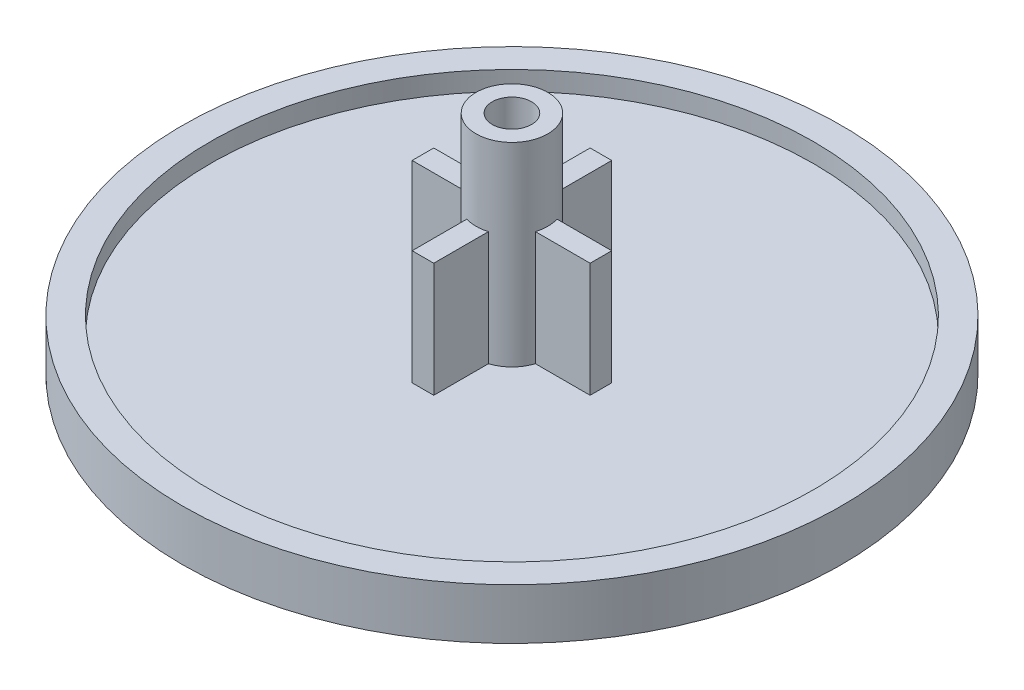
ISO-10303-21;
HEADER;
FILE_DESCRIPTION(('STEP AP214'),'2;1');
FILE_NAME('part.step','',(''),(''),'','','');
FILE_SCHEMA(('AUTOMOTIVE_DESIGN { 1 0 10303 214 1 1 1 1 }'));
ENDSEC;
DATA;
#1=APPLICATION_CONTEXT('core data for automotive mechanical design processes');
#2=APPLICATION_PROTOCOL_DEFINITION('international standard','automotive_design',2000,#1);
#3=PRODUCT_CONTEXT('',#1,'mechanical');
#4=PRODUCT('Part','Part','',(#3));
#5=PRODUCT_RELATED_PRODUCT_CATEGORY('part','',(#4));
#6=PRODUCT_DEFINITION_FORMATION('','',#4);
#7=PRODUCT_DEFINITION_CONTEXT('part definition',#1,'design');
#8=PRODUCT_DEFINITION('design','',#6,#7);
#9=PRODUCT_DEFINITION_SHAPE('','',#8);
#10=(LENGTH_UNIT() NAMED_UNIT(*) SI_UNIT(.MILLI.,.METRE.));
#11=(NAMED_UNIT(*) PLANE_ANGLE_UNIT() SI_UNIT($,.RADIAN.));
#12=(NAMED_UNIT(*) SI_UNIT($,.STERADIAN.) SOLID_ANGLE_UNIT());
#13=UNCERTAINTY_MEASURE_WITH_UNIT(LENGTH_MEASURE(1.E-05),#10,'distance_accuracy_value','');
#14=(GEOMETRIC_REPRESENTATION_CONTEXT(3) GLOBAL_UNCERTAINTY_ASSIGNED_CONTEXT((#13)) GLOBAL_UNIT_ASSIGNED_CONTEXT((#10,
#11,#12)) REPRESENTATION_CONTEXT('',''));
#15=CARTESIAN_POINT('',(0.,0.,0.));
#16=DIRECTION('',(0.,0.,1.));
#17=DIRECTION('',(1.,0.,0.));
#18=AXIS2_PLACEMENT_3D('',#15,#16,#17);
#19=CARTESIAN_POINT('',(0.,1.27,0.));
#20=DIRECTION('',(0.,1.,0.));
#21=DIRECTION('',(0.,0.,1.));
#22=AXIS2_PLACEMENT_3D('',#19,#20,#21);
#23=PLANE('',#22);
#24=CARTESIAN_POINT('',(0.,1.27,0.));
#25=DIRECTION('',(0.,1.,0.));
#26=DIRECTION('',(0.,0.,1.));
#27=AXIS2_PLACEMENT_3D('',#24,#25,#26);
#28=CIRCLE('',#27,12.0523);
#29=CARTESIAN_POINT('',(0.,1.27,-12.0523));
#30=VERTEX_POINT('',#29);
#31=EDGE_CURVE('E265',#30,#30,#28,.F.);
#32=ORIENTED_EDGE('',*,*,#31,.F.);
#33=EDGE_LOOP('',(#32));
#34=FACE_BOUND('',#33,.T.);
#35=DIRECTION('',(1.,0.,0.));
#36=VECTOR('',#35,1.);
#37=CARTESIAN_POINT('',(0.,1.27,-3.556));
#38=LINE('',#37,#36);
#39=CARTESIAN_POINT('',(-0.4318,1.27,-3.556));
#40=VERTEX_POINT('',#39);
#41=CARTESIAN_POINT('',(0.4318,1.27,-3.556));
#42=VERTEX_POINT('',#41);
#43=EDGE_CURVE('E211',#40,#42,#38,.T.);
#44=ORIENTED_EDGE('',*,*,#43,.T.);
#45=DIRECTION('',(0.,0.,1.));
#46=VECTOR('',#45,1.);
#47=CARTESIAN_POINT('',(0.4318,1.27,0.));
#48=LINE('',#47,#46);
#49=CARTESIAN_POINT('',(0.4318,1.27,-1.36859810390048));
#50=VERTEX_POINT('',#49);
#51=EDGE_CURVE('E168',#42,#50,#48,.T.);
#52=ORIENTED_EDGE('',*,*,#51,.T.);
#53=CARTESIAN_POINT('',(0.,1.27,0.));
#54=DIRECTION('',(0.,1.,0.));
#55=DIRECTION('',(0.,0.,1.));
#56=AXIS2_PLACEMENT_3D('',#53,#54,#55);
#57=CIRCLE('',#56,1.4351);
#58=CARTESIAN_POINT('',(1.36859810390048,1.27,-0.4318));
#59=VERTEX_POINT('',#58);
#60=EDGE_CURVE('E251',#59,#50,#57,.T.);
#61=ORIENTED_EDGE('',*,*,#60,.F.);
#62=DIRECTION('',(-1.,0.,0.));
#63=VECTOR('',#62,1.);
#64=CARTESIAN_POINT('',(0.,1.27,-0.4318));
#65=LINE('',#64,#63);
#66=CARTESIAN_POINT('',(3.556,1.27,-0.4318));
#67=VERTEX_POINT('',#66);
#68=EDGE_CURVE('E242',#67,#59,#65,.T.);
#69=ORIENTED_EDGE('',*,*,#68,.F.);
#70=DIRECTION('',(0.,0.,1.));
#71=VECTOR('',#70,1.);
#72=CARTESIAN_POINT('',(3.556,1.27,0.));
#73=LINE('',#72,#71);
#74=CARTESIAN_POINT('',(3.556,1.27,0.4318));
#75=VERTEX_POINT('',#74);
#76=EDGE_CURVE('E285',#67,#75,#73,.T.);
#77=ORIENTED_EDGE('',*,*,#76,.T.);
#78=DIRECTION('',(-1.,0.,0.));
#79=VECTOR('',#78,1.);
#80=CARTESIAN_POINT('',(0.,1.27,0.4318));
#81=LINE('',#80,#79);
#82=CARTESIAN_POINT('',(1.36859810390048,1.27,0.4318));
#83=VERTEX_POINT('',#82);
#84=EDGE_CURVE('E246',#75,#83,#81,.T.);
#85=ORIENTED_EDGE('',*,*,#84,.T.);
#86=CARTESIAN_POINT('',(0.4318,1.27,1.36859810390048));
#87=VERTEX_POINT('',#86);
#88=EDGE_CURVE('E256',#87,#83,#57,.T.);
#89=ORIENTED_EDGE('',*,*,#88,.F.);
#90=CARTESIAN_POINT('',(0.4318,1.27,3.556));
#91=VERTEX_POINT('',#90);
#92=EDGE_CURVE('E206',#87,#91,#48,.T.);
#93=ORIENTED_EDGE('',*,*,#92,.T.);
#94=DIRECTION('',(-1.,0.,0.));
#95=VECTOR('',#94,1.);
#96=CARTESIAN_POINT('',(0.,1.27,3.556));
#97=LINE('',#96,#95);
#98=CARTESIAN_POINT('',(-0.4318,1.27,3.556));
#99=VERTEX_POINT('',#98);
#100=EDGE_CURVE('E213',#91,#99,#97,.T.);
#101=ORIENTED_EDGE('',*,*,#100,.T.);
#102=DIRECTION('',(0.,0.,1.));
#103=VECTOR('',#102,1.);
#104=CARTESIAN_POINT('',(-0.4318,1.27,0.));
#105=LINE('',#104,#103);
#106=CARTESIAN_POINT('',(-0.4318,1.27,1.36859810390048));
#107=VERTEX_POINT('',#106);
#108=EDGE_CURVE('E200',#107,#99,#105,.T.);
#109=ORIENTED_EDGE('',*,*,#108,.F.);
#110=CARTESIAN_POINT('',(-1.36859810390048,1.27,0.4318));
#111=VERTEX_POINT('',#110);
#112=EDGE_CURVE('E252',#111,#107,#57,.T.);
#113=ORIENTED_EDGE('',*,*,#112,.F.);
#114=CARTESIAN_POINT('',(-3.556,1.27,0.4318));
#115=VERTEX_POINT('',#114);
#116=EDGE_CURVE('E243',#111,#115,#81,.T.);
#117=ORIENTED_EDGE('',*,*,#116,.T.);
#118=DIRECTION('',(0.,0.,-1.));
#119=VECTOR('',#118,1.);
#120=CARTESIAN_POINT('',(-3.556,1.27,0.));
#121=LINE('',#120,#119);
#122=CARTESIAN_POINT('',(-3.556,1.27,-0.4318));
#123=VERTEX_POINT('',#122);
#124=EDGE_CURVE('E283',#115,#123,#121,.T.);
#125=ORIENTED_EDGE('',*,*,#124,.T.);
#126=CARTESIAN_POINT('',(-1.36859810390048,1.27,-0.4318));
#127=VERTEX_POINT('',#126);
#128=EDGE_CURVE('E240',#127,#123,#65,.T.);
#129=ORIENTED_EDGE('',*,*,#128,.F.);
#130=CARTESIAN_POINT('',(-0.4318,1.27,-1.36859810390048));
#131=VERTEX_POINT('',#130);
#132=EDGE_CURVE('E255',#131,#127,#57,.T.);
#133=ORIENTED_EDGE('',*,*,#132,.F.);
#134=EDGE_CURVE('E71',#40,#131,#105,.T.);
#135=ORIENTED_EDGE('',*,*,#134,.F.);
#136=EDGE_LOOP('',(#44,#52,#61,#69,#77,#85,#89,#93,#101,#109,#113,#117,#125,#129,#133,#135));
#137=FACE_BOUND('',#136,.T.);
#138=ADVANCED_FACE('F48',(#34,#137),#23,.T.);
#139=CARTESIAN_POINT('',(0.,9.0424,0.));
#140=DIRECTION('',(0.,-1.,0.));
#141=DIRECTION('',(0.,0.,-1.));
#142=AXIS2_PLACEMENT_3D('',#139,#140,#141);
#143=CYLINDRICAL_SURFACE('',#142,1.4351);
#144=CARTESIAN_POINT('',(0.,9.0424,0.));
#145=DIRECTION('',(0.,1.,0.));
#146=DIRECTION('',(0.,0.,1.));
#147=AXIS2_PLACEMENT_3D('',#144,#145,#146);
#148=CIRCLE('',#147,1.4351);
#149=CARTESIAN_POINT('',(0.,9.0424,1.4351));
#150=VERTEX_POINT('',#149);
#151=EDGE_CURVE('E247',#150,#150,#148,.T.);
#152=ORIENTED_EDGE('',*,*,#151,.F.);
#153=EDGE_LOOP('',(#152));
#154=FACE_BOUND('',#153,.T.);
#155=DIRECTION('',(0.,-1.,0.));
#156=VECTOR('',#155,1.);
#157=CARTESIAN_POINT('',(0.4318,9.0424,-1.36859810390048));
#158=LINE('',#157,#156);
#159=CARTESIAN_POINT('',(0.4318,5.842,-1.36859810390048));
#160=VERTEX_POINT('',#159);
#161=EDGE_CURVE('E209',#160,#50,#158,.T.);
#162=ORIENTED_EDGE('',*,*,#161,.F.);
#163=CARTESIAN_POINT('',(0.,5.842,0.));
#164=DIRECTION('',(0.,-1.,0.));
#165=DIRECTION('',(0.,0.,-1.));
#166=AXIS2_PLACEMENT_3D('',#163,#164,#165);
#167=CIRCLE('',#166,1.4351);
#168=CARTESIAN_POINT('',(-0.4318,5.842,-1.36859810390048));
#169=VERTEX_POINT('',#168);
#170=EDGE_CURVE('E13',#169,#160,#167,.T.);
#171=ORIENTED_EDGE('',*,*,#170,.F.);
#172=DIRECTION('',(0.,-1.,0.));
#173=VECTOR('',#172,1.);
#174=CARTESIAN_POINT('',(-0.4318,9.0424,-1.36859810390048));
#175=LINE('',#174,#173);
#176=EDGE_CURVE('E202',#169,#131,#175,.T.);
#177=ORIENTED_EDGE('',*,*,#176,.T.);
#178=ORIENTED_EDGE('',*,*,#132,.T.);
#179=DIRECTION('',(0.,-1.,0.));
#180=VECTOR('',#179,1.);
#181=CARTESIAN_POINT('',(-1.36859810390048,9.0424,-0.4318));
#182=LINE('',#181,#180);
#183=CARTESIAN_POINT('',(-1.36859810390048,5.842,-0.4318));
#184=VERTEX_POINT('',#183);
#185=EDGE_CURVE('E268',#127,#184,#182,.F.);
#186=ORIENTED_EDGE('',*,*,#185,.T.);
#187=CARTESIAN_POINT('',(0.,5.842,0.));
#188=DIRECTION('',(0.,-1.,0.));
#189=DIRECTION('',(0.,0.,-1.));
#190=AXIS2_PLACEMENT_3D('',#187,#188,#189);
#191=CIRCLE('',#190,1.4351);
#192=CARTESIAN_POINT('',(-1.36859810390048,5.842,0.4318));
#193=VERTEX_POINT('',#192);
#194=EDGE_CURVE('E271',#193,#184,#191,.T.);
#195=ORIENTED_EDGE('',*,*,#194,.F.);
#196=DIRECTION('',(0.,-1.,0.));
#197=VECTOR('',#196,1.);
#198=CARTESIAN_POINT('',(-1.36859810390048,9.0424,0.4318));
#199=LINE('',#198,#197);
#200=EDGE_CURVE('E274',#111,#193,#199,.F.);
#201=ORIENTED_EDGE('',*,*,#200,.F.);
#202=ORIENTED_EDGE('',*,*,#112,.T.);
#203=DIRECTION('',(0.,-1.,0.));
#204=VECTOR('',#203,1.);
#205=CARTESIAN_POINT('',(-0.4318,9.0424,1.36859810390048));
#206=LINE('',#205,#204);
#207=CARTESIAN_POINT('',(-0.4318,5.842,1.36859810390048));
#208=VERTEX_POINT('',#207);
#209=EDGE_CURVE('E181',#107,#208,#206,.F.);
#210=ORIENTED_EDGE('',*,*,#209,.T.);
#211=CARTESIAN_POINT('',(0.4318,5.842,1.36859810390048));
#212=VERTEX_POINT('',#211);
#213=EDGE_CURVE('E52',#212,#208,#167,.T.);
#214=ORIENTED_EDGE('',*,*,#213,.F.);
#215=DIRECTION('',(0.,-1.,0.));
#216=VECTOR('',#215,1.);
#217=CARTESIAN_POINT('',(0.4318,9.0424,1.36859810390048));
#218=LINE('',#217,#216);
#219=EDGE_CURVE('E204',#87,#212,#218,.F.);
#220=ORIENTED_EDGE('',*,*,#219,.F.);
#221=ORIENTED_EDGE('',*,*,#88,.T.);
#222=DIRECTION('',(0.,-1.,0.));
#223=VECTOR('',#222,1.);
#224=CARTESIAN_POINT('',(1.36859810390048,9.0424,0.4318));
#225=LINE('',#224,#223);
#226=CARTESIAN_POINT('',(1.36859810390048,5.842,0.4318));
#227=VERTEX_POINT('',#226);
#228=EDGE_CURVE('E280',#227,#83,#225,.T.);
#229=ORIENTED_EDGE('',*,*,#228,.F.);
#230=CARTESIAN_POINT('',(1.36859810390048,5.842,-0.4318));
#231=VERTEX_POINT('',#230);
#232=EDGE_CURVE('E275',#231,#227,#191,.T.);
#233=ORIENTED_EDGE('',*,*,#232,.F.);
#234=DIRECTION('',(0.,-1.,0.));
#235=VECTOR('',#234,1.);
#236=CARTESIAN_POINT('',(1.36859810390048,9.0424,-0.4318));
#237=LINE('',#236,#235);
#238=EDGE_CURVE('E277',#231,#59,#237,.T.);
#239=ORIENTED_EDGE('',*,*,#238,.T.);
#240=ORIENTED_EDGE('',*,*,#60,.T.);
#241=EDGE_LOOP('',(#162,#171,#177,#178,#186,#195,#201,#202,#210,#214,#220,#221,#229,#233,#239,#240));
#242=FACE_BOUND('',#241,.T.);
#243=ADVANCED_FACE('F297',(#154,#242),#143,.T.);
#244=CARTESIAN_POINT('',(0.,1.27,0.));
#245=DIRECTION('',(0.,-1.,0.));
#246=DIRECTION('',(0.,0.,-1.));
#247=AXIS2_PLACEMENT_3D('',#244,#245,#246);
#248=CYLINDRICAL_SURFACE('',#247,13.1699);
#249=CARTESIAN_POINT('',(0.,0.,0.));
#250=DIRECTION('',(0.,1.,0.));
#251=DIRECTION('',(0.,0.,1.));
#252=AXIS2_PLACEMENT_3D('',#249,#250,#251);
#253=CIRCLE('',#252,13.1699);
#254=CARTESIAN_POINT('',(0.,0.,13.1699));
#255=VERTEX_POINT('',#254);
#256=EDGE_CURVE('E262',#255,#255,#253,.T.);
#257=ORIENTED_EDGE('',*,*,#256,.T.);
#258=EDGE_LOOP('',(#257));
#259=FACE_BOUND('',#258,.T.);
#260=CARTESIAN_POINT('',(0.,2.032,0.));
#261=DIRECTION('',(0.,1.,0.));
#262=DIRECTION('',(0.,0.,1.));
#263=AXIS2_PLACEMENT_3D('',#260,#261,#262);
#264=CIRCLE('',#263,13.1699);
#265=CARTESIAN_POINT('',(0.,2.032,13.1699));
#266=VERTEX_POINT('',#265);
#267=EDGE_CURVE('E259',#266,#266,#264,.T.);
#268=ORIENTED_EDGE('',*,*,#267,.F.);
#269=EDGE_LOOP('',(#268));
#270=FACE_BOUND('',#269,.T.);
#271=ADVANCED_FACE('F50',(#259,#270),#248,.T.);
#272=CARTESIAN_POINT('',(0.,0.,0.));
#273=DIRECTION('',(0.,1.,0.));
#274=DIRECTION('',(0.,0.,1.));
#275=AXIS2_PLACEMENT_3D('',#272,#273,#274);
#276=PLANE('',#275);
#277=ORIENTED_EDGE('',*,*,#256,.F.);
#278=EDGE_LOOP('',(#277));
#279=FACE_BOUND('',#278,.T.);
#280=ADVANCED_FACE('F332',(#279),#276,.F.);
#281=CARTESIAN_POINT('',(0.,2.032,0.));
#282=DIRECTION('',(0.,1.,0.));
#283=DIRECTION('',(0.,0.,1.));
#284=AXIS2_PLACEMENT_3D('',#281,#282,#283);
#285=PLANE('',#284);
#286=ORIENTED_EDGE('',*,*,#267,.T.);
#287=EDGE_LOOP('',(#286));
#288=FACE_BOUND('',#287,.T.);
#289=CARTESIAN_POINT('',(0.,2.032,0.));
#290=DIRECTION('',(0.,1.,0.));
#291=DIRECTION('',(0.,0.,1.));
#292=AXIS2_PLACEMENT_3D('',#289,#290,#291);
#293=CIRCLE('',#292,12.0523);
#294=CARTESIAN_POINT('',(0.,2.032,-12.0523));
#295=VERTEX_POINT('',#294);
#296=EDGE_CURVE('E250',#295,#295,#293,.T.);
#297=ORIENTED_EDGE('',*,*,#296,.F.);
#298=EDGE_LOOP('',(#297));
#299=FACE_BOUND('',#298,.T.);
#300=ADVANCED_FACE('F340',(#288,#299),#285,.T.);
#301=CARTESIAN_POINT('',(0.,2.032,0.));
#302=DIRECTION('',(0.,-1.,0.));
#303=DIRECTION('',(0.,0.,-1.));
#304=AXIS2_PLACEMENT_3D('',#301,#302,#303);
#305=CYLINDRICAL_SURFACE('',#304,12.0523);
#306=CARTESIAN_POINT('',(0.,2.032,-12.0523));
#307=CARTESIAN_POINT('',(0.,2.0240625,-12.0523));
#308=CARTESIAN_POINT('',(0.,2.016125,-12.0523));
#309=CARTESIAN_POINT('',(0.,2.00025,-12.0523));
#310=CARTESIAN_POINT('',(0.,1.9923125,-12.0523));
#311=CARTESIAN_POINT('',(0.,1.9764375,-12.0523));
#312=CARTESIAN_POINT('',(0.,1.9685,-12.0523));
#313=CARTESIAN_POINT('',(0.,1.952625,-12.0523));
#314=CARTESIAN_POINT('',(0.,1.9446875,-12.0523));
#315=CARTESIAN_POINT('',(0.,1.9288125,-12.0523));
#316=CARTESIAN_POINT('',(0.,1.920875,-12.0523));
#317=CARTESIAN_POINT('',(0.,1.905,-12.0523));
#318=CARTESIAN_POINT('',(0.,1.8970625,-12.0523));
#319=CARTESIAN_POINT('',(0.,1.8811875,-12.0523));
#320=CARTESIAN_POINT('',(0.,1.87325,-12.0523));
#321=CARTESIAN_POINT('',(0.,1.857375,-12.0523));
#322=CARTESIAN_POINT('',(0.,1.8494375,-12.0523));
#323=CARTESIAN_POINT('',(0.,1.8335625,-12.0523));
#324=CARTESIAN_POINT('',(0.,1.825625,-12.0523));
#325=CARTESIAN_POINT('',(0.,1.80975,-12.0523));
#326=CARTESIAN_POINT('',(0.,1.8018125,-12.0523));
#327=CARTESIAN_POINT('',(0.,1.7859375,-12.0523));
#328=CARTESIAN_POINT('',(0.,1.778,-12.0523));
#329=CARTESIAN_POINT('',(0.,1.762125,-12.0523));
#330=CARTESIAN_POINT('',(0.,1.7541875,-12.0523));
#331=CARTESIAN_POINT('',(0.,1.7383125,-12.0523));
#332=CARTESIAN_POINT('',(0.,1.730375,-12.0523));
#333=CARTESIAN_POINT('',(0.,1.7145,-12.0523));
#334=CARTESIAN_POINT('',(0.,1.7065625,-12.0523));
#335=CARTESIAN_POINT('',(0.,1.6906875,-12.0523));
#336=CARTESIAN_POINT('',(0.,1.68275,-12.0523));
#337=CARTESIAN_POINT('',(0.,1.666875,-12.0523));
#338=CARTESIAN_POINT('',(0.,1.6589375,-12.0523));
#339=CARTESIAN_POINT('',(0.,1.6430625,-12.0523));
#340=CARTESIAN_POINT('',(0.,1.635125,-12.0523));
#341=CARTESIAN_POINT('',(0.,1.61925,-12.0523));
#342=CARTESIAN_POINT('',(0.,1.6113125,-12.0523));
#343=CARTESIAN_POINT('',(0.,1.5954375,-12.0523));
#344=CARTESIAN_POINT('',(0.,1.5875,-12.0523));
#345=CARTESIAN_POINT('',(0.,1.571625,-12.0523));
#346=CARTESIAN_POINT('',(0.,1.5636875,-12.0523));
#347=CARTESIAN_POINT('',(0.,1.5478125,-12.0523));
#348=CARTESIAN_POINT('',(0.,1.539875,-12.0523));
#349=CARTESIAN_POINT('',(0.,1.524,-12.0523));
#350=CARTESIAN_POINT('',(0.,1.5160625,-12.0523));
#351=CARTESIAN_POINT('',(0.,1.5001875,-12.0523));
#352=CARTESIAN_POINT('',(0.,1.49225,-12.0523));
#353=CARTESIAN_POINT('',(0.,1.476375,-12.0523));
#354=CARTESIAN_POINT('',(0.,1.4684375,-12.0523));
#355=CARTESIAN_POINT('',(0.,1.4525625,-12.0523));
#356=CARTESIAN_POINT('',(0.,1.444625,-12.0523));
#357=CARTESIAN_POINT('',(0.,1.42875,-12.0523));
#358=CARTESIAN_POINT('',(0.,1.4208125,-12.0523));
#359=CARTESIAN_POINT('',(0.,1.4049375,-12.0523));
#360=CARTESIAN_POINT('',(0.,1.397,-12.0523));
#361=CARTESIAN_POINT('',(0.,1.381125,-12.0523));
#362=CARTESIAN_POINT('',(0.,1.3731875,-12.0523));
#363=CARTESIAN_POINT('',(0.,1.3573125,-12.0523));
#364=CARTESIAN_POINT('',(0.,1.349375,-12.0523));
#365=CARTESIAN_POINT('',(0.,1.3335,-12.0523));
#366=CARTESIAN_POINT('',(0.,1.3255625,-12.0523));
#367=CARTESIAN_POINT('',(0.,1.3096875,-12.0523));
#368=CARTESIAN_POINT('',(0.,1.30175,-12.0523));
#369=CARTESIAN_POINT('',(0.,1.285875,-12.0523));
#370=CARTESIAN_POINT('',(0.,1.2779375,-12.0523));
#371=CARTESIAN_POINT('',(0.,1.27,-12.0523));
#372=B_SPLINE_CURVE_WITH_KNOTS('',3,(#306,#307,#308,#309,#310,#311,#312,#313,#314,#315,#316,
#317,#318,#319,#320,#321,#322,#323,#324,#325,#326,#327,#328,#329,#330,#331,#332,#333,#334,#335,
#336,#337,#338,#339,#340,#341,#342,#343,#344,#345,#346,#347,#348,#349,#350,#351,#352,#353,#354,
#355,#356,#357,#358,#359,#360,#361,#362,#363,#364,#365,#366,#367,#368,#369,#370,#371),
.UNSPECIFIED.,.F.,.F.,(4,2,2,2,2,2,2,2,2,2,2,2,2,2,2,2,2,2,2,2,2,2,2,2,2,2,2,2,2,2,2,2,4),(0.,
0.0238125000000004,0.0476250000000004,0.0714375000000003,0.0952500000000003,0.1190625,0.142875,
0.1666875,0.1905,0.2143125,0.238125,0.2619375,0.28575,0.3095625,0.333375,0.3571875,0.381,
0.4048125,0.428625,0.4524375,0.47625,0.5000625,0.523875,0.5476875,0.5715,0.5953125,0.619125,
0.6429375,0.66675,0.6905625,0.714375,0.7381875,0.762),.UNSPECIFIED.);
#373=EDGE_CURVE('BSEAM322',#295,#30,#372,.T.);
#374=ORIENTED_EDGE('',*,*,#296,.T.);
#375=ORIENTED_EDGE('',*,*,#31,.T.);
#376=ORIENTED_EDGE('',*,*,#373,.T.);
#377=ORIENTED_EDGE('',*,*,#373,.F.);
#378=EDGE_LOOP('',(#374,#376,#375,#377));
#379=FACE_BOUND('',#378,.T.);
#380=ADVANCED_FACE('F322',(#379),#305,.F.);
#381=CARTESIAN_POINT('',(0.,9.0424,0.));
#382=DIRECTION('',(0.,1.,0.));
#383=DIRECTION('',(0.,0.,1.));
#384=AXIS2_PLACEMENT_3D('',#381,#382,#383);
#385=PLANE('',#384);
#386=CARTESIAN_POINT('',(0.,9.0424,0.));
#387=DIRECTION('',(0.,1.,0.));
#388=DIRECTION('',(0.,0.,1.));
#389=AXIS2_PLACEMENT_3D('',#386,#387,#388);
#390=CIRCLE('',#389,0.7874);
#391=CARTESIAN_POINT('',(0.,9.0424,0.7874));
#392=VERTEX_POINT('',#391);
#393=EDGE_CURVE('E312',#392,#392,#390,.T.);
#394=ORIENTED_EDGE('',*,*,#393,.F.);
#395=EDGE_LOOP('',(#394));
#396=FACE_BOUND('',#395,.T.);
#397=ORIENTED_EDGE('',*,*,#151,.T.);
#398=EDGE_LOOP('',(#397));
#399=FACE_BOUND('',#398,.T.);
#400=ADVANCED_FACE('F318',(#396,#399),#385,.T.);
#401=CARTESIAN_POINT('',(0.,0.,-0.4318));
#402=DIRECTION('',(0.,0.,-1.));
#403=DIRECTION('',(-1.,0.,0.));
#404=AXIS2_PLACEMENT_3D('',#401,#402,#403);
#405=PLANE('',#404);
#406=ORIENTED_EDGE('',*,*,#185,.F.);
#407=ORIENTED_EDGE('',*,*,#128,.T.);
#408=DIRECTION('',(0.,-1.,0.));
#409=VECTOR('',#408,1.);
#410=CARTESIAN_POINT('',(-3.556,0.,-0.4318));
#411=LINE('',#410,#409);
#412=CARTESIAN_POINT('',(-3.556,5.842,-0.4318));
#413=VERTEX_POINT('',#412);
#414=EDGE_CURVE('E216',#413,#123,#411,.T.);
#415=ORIENTED_EDGE('',*,*,#414,.F.);
#416=DIRECTION('',(-1.,0.,0.));
#417=VECTOR('',#416,1.);
#418=CARTESIAN_POINT('',(-3.556,5.842,-0.4318));
#419=LINE('',#418,#417);
#420=EDGE_CURVE('E232',#184,#413,#419,.T.);
#421=ORIENTED_EDGE('',*,*,#420,.F.);
#422=EDGE_LOOP('',(#406,#407,#415,#421));
#423=FACE_BOUND('',#422,.T.);
#424=ADVANCED_FACE('F321',(#423),#405,.T.);
#425=CARTESIAN_POINT('',(0.,0.,0.4318));
#426=DIRECTION('',(0.,0.,-1.));
#427=DIRECTION('',(-1.,0.,0.));
#428=AXIS2_PLACEMENT_3D('',#425,#426,#427);
#429=PLANE('',#428);
#430=ORIENTED_EDGE('',*,*,#116,.F.);
#431=ORIENTED_EDGE('',*,*,#200,.T.);
#432=DIRECTION('',(-1.,0.,0.));
#433=VECTOR('',#432,1.);
#434=CARTESIAN_POINT('',(-3.556,5.842,0.4318));
#435=LINE('',#434,#433);
#436=CARTESIAN_POINT('',(-3.556,5.842,0.4318));
#437=VERTEX_POINT('',#436);
#438=EDGE_CURVE('E223',#193,#437,#435,.T.);
#439=ORIENTED_EDGE('',*,*,#438,.T.);
#440=DIRECTION('',(0.,-1.,0.));
#441=VECTOR('',#440,1.);
#442=CARTESIAN_POINT('',(-3.556,0.,0.4318));
#443=LINE('',#442,#441);
#444=EDGE_CURVE('E217',#437,#115,#443,.T.);
#445=ORIENTED_EDGE('',*,*,#444,.T.);
#446=EDGE_LOOP('',(#430,#431,#439,#445));
#447=FACE_BOUND('',#446,.T.);
#448=ADVANCED_FACE('F378',(#447),#429,.F.);
#449=CARTESIAN_POINT('',(-3.556,5.842,0.4318));
#450=DIRECTION('',(0.,-1.,0.));
#451=DIRECTION('',(0.,0.,-1.));
#452=AXIS2_PLACEMENT_3D('',#449,#450,#451);
#453=PLANE('',#452);
#454=ORIENTED_EDGE('',*,*,#438,.F.);
#455=ORIENTED_EDGE('',*,*,#194,.T.);
#456=ORIENTED_EDGE('',*,*,#420,.T.);
#457=DIRECTION('',(0.,0.,-1.));
#458=VECTOR('',#457,1.);
#459=CARTESIAN_POINT('',(-3.556,5.842,0.4318));
#460=LINE('',#459,#458);
#461=EDGE_CURVE('E227',#437,#413,#460,.T.);
#462=ORIENTED_EDGE('',*,*,#461,.F.);
#463=EDGE_LOOP('',(#454,#455,#456,#462));
#464=FACE_BOUND('',#463,.T.);
#465=ADVANCED_FACE('F387',(#464),#453,.F.);
#466=CARTESIAN_POINT('',(-3.556,0.,0.4318));
#467=DIRECTION('',(1.,0.,0.));
#468=DIRECTION('',(0.,0.,-1.));
#469=AXIS2_PLACEMENT_3D('',#466,#467,#468);
#470=PLANE('',#469);
#471=ORIENTED_EDGE('',*,*,#124,.F.);
#472=ORIENTED_EDGE('',*,*,#444,.F.);
#473=ORIENTED_EDGE('',*,*,#461,.T.);
#474=ORIENTED_EDGE('',*,*,#414,.T.);
#475=EDGE_LOOP('',(#471,#472,#473,#474));
#476=FACE_BOUND('',#475,.T.);
#477=ADVANCED_FACE('F396',(#476),#470,.F.);
#478=CARTESIAN_POINT('',(3.556,5.842,-0.4318));
#479=VERTEX_POINT('',#478);
#480=EDGE_CURVE('E221',#479,#231,#419,.T.);
#481=ORIENTED_EDGE('',*,*,#480,.T.);
#482=ORIENTED_EDGE('',*,*,#232,.T.);
#483=CARTESIAN_POINT('',(3.556,5.842,0.4318));
#484=VERTEX_POINT('',#483);
#485=EDGE_CURVE('E224',#484,#227,#435,.T.);
#486=ORIENTED_EDGE('',*,*,#485,.F.);
#487=DIRECTION('',(0.,0.,-1.));
#488=VECTOR('',#487,1.);
#489=CARTESIAN_POINT('',(3.556,5.842,0.4318));
#490=LINE('',#489,#488);
#491=EDGE_CURVE('E237',#484,#479,#490,.T.);
#492=ORIENTED_EDGE('',*,*,#491,.T.);
#493=EDGE_LOOP('',(#481,#482,#486,#492));
#494=FACE_BOUND('',#493,.T.);
#495=ADVANCED_FACE('F399',(#494),#453,.F.);
#496=ORIENTED_EDGE('',*,*,#84,.F.);
#497=DIRECTION('',(0.,1.,0.));
#498=VECTOR('',#497,1.);
#499=CARTESIAN_POINT('',(3.556,0.,0.4318));
#500=LINE('',#499,#498);
#501=EDGE_CURVE('E220',#75,#484,#500,.T.);
#502=ORIENTED_EDGE('',*,*,#501,.T.);
#503=ORIENTED_EDGE('',*,*,#485,.T.);
#504=ORIENTED_EDGE('',*,*,#228,.T.);
#505=EDGE_LOOP('',(#496,#502,#503,#504));
#506=FACE_BOUND('',#505,.T.);
#507=ADVANCED_FACE('F390',(#506),#429,.F.);
#508=DIRECTION('',(0.,1.,0.));
#509=VECTOR('',#508,1.);
#510=CARTESIAN_POINT('',(3.556,0.,-0.4318));
#511=LINE('',#510,#509);
#512=EDGE_CURVE('E230',#67,#479,#511,.T.);
#513=ORIENTED_EDGE('',*,*,#512,.F.);
#514=ORIENTED_EDGE('',*,*,#68,.T.);
#515=ORIENTED_EDGE('',*,*,#238,.F.);
#516=ORIENTED_EDGE('',*,*,#480,.F.);
#517=EDGE_LOOP('',(#513,#514,#515,#516));
#518=FACE_BOUND('',#517,.T.);
#519=ADVANCED_FACE('F381',(#518),#405,.T.);
#520=CARTESIAN_POINT('',(3.556,0.,0.4318));
#521=DIRECTION('',(-1.,0.,0.));
#522=DIRECTION('',(0.,0.,1.));
#523=AXIS2_PLACEMENT_3D('',#520,#521,#522);
#524=PLANE('',#523);
#525=ORIENTED_EDGE('',*,*,#76,.F.);
#526=ORIENTED_EDGE('',*,*,#512,.T.);
#527=ORIENTED_EDGE('',*,*,#491,.F.);
#528=ORIENTED_EDGE('',*,*,#501,.F.);
#529=EDGE_LOOP('',(#525,#526,#527,#528));
#530=FACE_BOUND('',#529,.T.);
#531=ADVANCED_FACE('F423',(#530),#524,.F.);
#532=CARTESIAN_POINT('',(-0.4318,0.,0.));
#533=DIRECTION('',(-1.,0.,0.));
#534=DIRECTION('',(0.,0.,1.));
#535=AXIS2_PLACEMENT_3D('',#532,#533,#534);
#536=PLANE('',#535);
#537=ORIENTED_EDGE('',*,*,#209,.F.);
#538=ORIENTED_EDGE('',*,*,#108,.T.);
#539=DIRECTION('',(0.,-1.,0.));
#540=VECTOR('',#539,1.);
#541=CARTESIAN_POINT('',(-0.4318,0.,3.556));
#542=LINE('',#541,#540);
#543=CARTESIAN_POINT('',(-0.4318,5.842,3.556));
#544=VERTEX_POINT('',#543);
#545=EDGE_CURVE('E191',#544,#99,#542,.T.);
#546=ORIENTED_EDGE('',*,*,#545,.F.);
#547=DIRECTION('',(0.,0.,1.));
#548=VECTOR('',#547,1.);
#549=CARTESIAN_POINT('',(-0.4318,5.842,3.556));
#550=LINE('',#549,#548);
#551=EDGE_CURVE('E63',#208,#544,#550,.T.);
#552=ORIENTED_EDGE('',*,*,#551,.F.);
#553=EDGE_LOOP('',(#537,#538,#546,#552));
#554=FACE_BOUND('',#553,.T.);
#555=ADVANCED_FACE('F301',(#554),#536,.T.);
#556=CARTESIAN_POINT('',(0.4318,0.,0.));
#557=DIRECTION('',(-1.,0.,0.));
#558=DIRECTION('',(0.,0.,1.));
#559=AXIS2_PLACEMENT_3D('',#556,#557,#558);
#560=PLANE('',#559);
#561=ORIENTED_EDGE('',*,*,#92,.F.);
#562=ORIENTED_EDGE('',*,*,#219,.T.);
#563=DIRECTION('',(0.,0.,1.));
#564=VECTOR('',#563,1.);
#565=CARTESIAN_POINT('',(0.4318,5.842,3.556));
#566=LINE('',#565,#564);
#567=CARTESIAN_POINT('',(0.4318,5.842,3.556));
#568=VERTEX_POINT('',#567);
#569=EDGE_CURVE('E171',#212,#568,#566,.T.);
#570=ORIENTED_EDGE('',*,*,#569,.T.);
#571=DIRECTION('',(0.,-1.,0.));
#572=VECTOR('',#571,1.);
#573=CARTESIAN_POINT('',(0.4318,0.,3.556));
#574=LINE('',#573,#572);
#575=EDGE_CURVE('E172',#568,#91,#574,.T.);
#576=ORIENTED_EDGE('',*,*,#575,.T.);
#577=EDGE_LOOP('',(#561,#562,#570,#576));
#578=FACE_BOUND('',#577,.T.);
#579=ADVANCED_FACE('F308',(#578),#560,.F.);
#580=CARTESIAN_POINT('',(0.4318,5.842,3.556));
#581=DIRECTION('',(0.,-1.,0.));
#582=DIRECTION('',(0.,0.,-1.));
#583=AXIS2_PLACEMENT_3D('',#580,#581,#582);
#584=PLANE('',#583);
#585=ORIENTED_EDGE('',*,*,#569,.F.);
#586=ORIENTED_EDGE('',*,*,#213,.T.);
#587=ORIENTED_EDGE('',*,*,#551,.T.);
#588=DIRECTION('',(-1.,0.,0.));
#589=VECTOR('',#588,1.);
#590=CARTESIAN_POINT('',(0.4318,5.842,3.556));
#591=LINE('',#590,#589);
#592=EDGE_CURVE('E182',#568,#544,#591,.T.);
#593=ORIENTED_EDGE('',*,*,#592,.F.);
#594=EDGE_LOOP('',(#585,#586,#587,#593));
#595=FACE_BOUND('',#594,.T.);
#596=ADVANCED_FACE('F293',(#595),#584,.F.);
#597=CARTESIAN_POINT('',(0.4318,0.,3.556));
#598=DIRECTION('',(0.,0.,-1.));
#599=DIRECTION('',(-1.,0.,0.));
#600=AXIS2_PLACEMENT_3D('',#597,#598,#599);
#601=PLANE('',#600);
#602=ORIENTED_EDGE('',*,*,#100,.F.);
#603=ORIENTED_EDGE('',*,*,#575,.F.);
#604=ORIENTED_EDGE('',*,*,#592,.T.);
#605=ORIENTED_EDGE('',*,*,#545,.T.);
#606=EDGE_LOOP('',(#602,#603,#604,#605));
#607=FACE_BOUND('',#606,.T.);
#608=ADVANCED_FACE('F306',(#607),#601,.F.);
#609=ORIENTED_EDGE('',*,*,#51,.F.);
#610=DIRECTION('',(0.,1.,0.));
#611=VECTOR('',#610,1.);
#612=CARTESIAN_POINT('',(0.4318,0.,-3.556));
#613=LINE('',#612,#611);
#614=CARTESIAN_POINT('',(0.4318,5.842,-3.556));
#615=VERTEX_POINT('',#614);
#616=EDGE_CURVE('E161',#42,#615,#613,.T.);
#617=ORIENTED_EDGE('',*,*,#616,.T.);
#618=EDGE_CURVE('E165',#615,#160,#566,.T.);
#619=ORIENTED_EDGE('',*,*,#618,.T.);
#620=ORIENTED_EDGE('',*,*,#161,.T.);
#621=EDGE_LOOP('',(#609,#617,#619,#620));
#622=FACE_BOUND('',#621,.T.);
#623=ADVANCED_FACE('F163',(#622),#560,.F.);
#624=DIRECTION('',(0.,1.,0.));
#625=VECTOR('',#624,1.);
#626=CARTESIAN_POINT('',(-0.4318,0.,-3.556));
#627=LINE('',#626,#625);
#628=CARTESIAN_POINT('',(-0.4318,5.842,-3.556));
#629=VERTEX_POINT('',#628);
#630=EDGE_CURVE('E177',#40,#629,#627,.T.);
#631=ORIENTED_EDGE('',*,*,#630,.F.);
#632=ORIENTED_EDGE('',*,*,#134,.T.);
#633=ORIENTED_EDGE('',*,*,#176,.F.);
#634=EDGE_CURVE('E196',#629,#169,#550,.T.);
#635=ORIENTED_EDGE('',*,*,#634,.F.);
#636=EDGE_LOOP('',(#631,#632,#633,#635));
#637=FACE_BOUND('',#636,.T.);
#638=ADVANCED_FACE('F438',(#637),#536,.T.);
#639=CARTESIAN_POINT('',(0.4318,0.,-3.556));
#640=DIRECTION('',(0.,0.,1.));
#641=DIRECTION('',(1.,0.,0.));
#642=AXIS2_PLACEMENT_3D('',#639,#640,#641);
#643=PLANE('',#642);
#644=ORIENTED_EDGE('',*,*,#43,.F.);
#645=ORIENTED_EDGE('',*,*,#630,.T.);
#646=DIRECTION('',(-1.,0.,0.));
#647=VECTOR('',#646,1.);
#648=CARTESIAN_POINT('',(0.4318,5.842,-3.556));
#649=LINE('',#648,#647);
#650=EDGE_CURVE('E175',#615,#629,#649,.T.);
#651=ORIENTED_EDGE('',*,*,#650,.F.);
#652=ORIENTED_EDGE('',*,*,#616,.F.);
#653=EDGE_LOOP('',(#644,#645,#651,#652));
#654=FACE_BOUND('',#653,.T.);
#655=ADVANCED_FACE('F176',(#654),#643,.F.);
#656=ORIENTED_EDGE('',*,*,#634,.T.);
#657=ORIENTED_EDGE('',*,*,#170,.T.);
#658=ORIENTED_EDGE('',*,*,#618,.F.);
#659=ORIENTED_EDGE('',*,*,#650,.T.);
#660=EDGE_LOOP('',(#656,#657,#658,#659));
#661=FACE_BOUND('',#660,.T.);
#662=ADVANCED_FACE('F184',(#661),#584,.F.);
#663=CARTESIAN_POINT('',(0.,-0.957103518025151,0.));
#664=DIRECTION('',(0.,1.,0.));
#665=DIRECTION('',(0.,0.,1.));
#666=AXIS2_PLACEMENT_3D('',#663,#664,#665);
#667=CYLINDRICAL_SURFACE('',#666,0.7874);
#668=CARTESIAN_POINT('',(0.,1.27,0.));
#669=DIRECTION('',(0.,1.,0.));
#670=DIRECTION('',(0.,0.,1.));
#671=AXIS2_PLACEMENT_3D('',#668,#669,#670);
#672=CIRCLE('',#671,0.7874);
#673=CARTESIAN_POINT('',(0.,1.27,0.7874));
#674=VERTEX_POINT('',#673);
#675=EDGE_CURVE('E194',#674,#674,#672,.F.);
#676=ORIENTED_EDGE('',*,*,#675,.T.);
#677=EDGE_LOOP('',(#676));
#678=FACE_BOUND('',#677,.T.);
#679=ORIENTED_EDGE('',*,*,#393,.T.);
#680=EDGE_LOOP('',(#679));
#681=FACE_BOUND('',#680,.T.);
#682=ADVANCED_FACE('F316',(#678,#681),#667,.F.);
#683=CARTESIAN_POINT('',(0.,1.27,0.));
#684=DIRECTION('',(0.,1.,0.));
#685=DIRECTION('',(0.,0.,1.));
#686=AXIS2_PLACEMENT_3D('',#683,#684,#685);
#687=PLANE('',#686);
#688=ORIENTED_EDGE('',*,*,#675,.F.);
#689=EDGE_LOOP('',(#688));
#690=FACE_BOUND('',#689,.T.);
#691=ADVANCED_FACE('F481',(#690),#687,.T.);
#692=CLOSED_SHELL('',(#138,#243,#271,#280,#300,#380,#400,#424,#448,#465,#477,#495,#507,#519,
#531,#555,#579,#596,#608,#623,#638,#655,#662,#682,#691));
#693=MANIFOLD_SOLID_BREP('B2',#692);
#694=ADVANCED_BREP_SHAPE_REPRESENTATION('',(#18,#693),#14);
#695=SHAPE_DEFINITION_REPRESENTATION(#9,#694);
ENDSEC;
END-ISO-10303-21;
